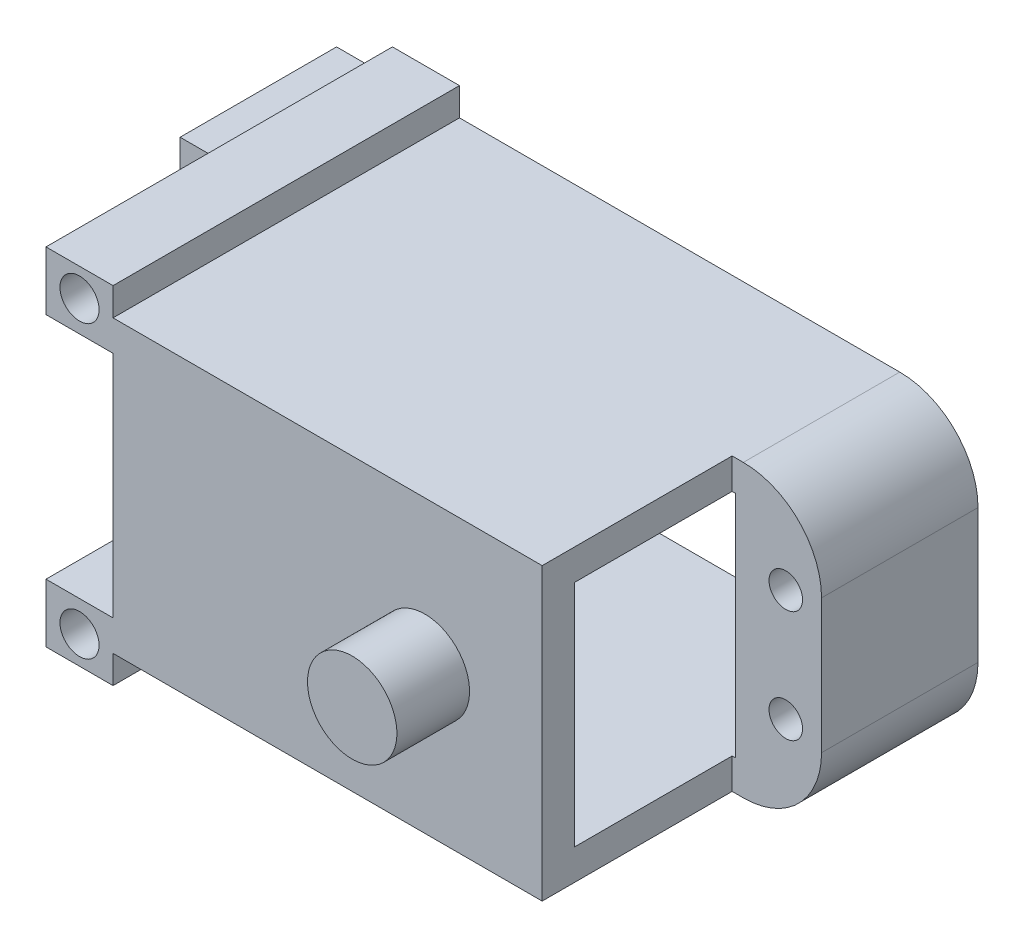
ISO-10303-21;
HEADER;
FILE_DESCRIPTION(('STEP AP214'),'2;1');
FILE_NAME('part.step','',(''),(''),'','','');
FILE_SCHEMA(('AUTOMOTIVE_DESIGN { 1 0 10303 214 1 1 1 1 }'));
ENDSEC;
DATA;
#1=APPLICATION_CONTEXT('core data for automotive mechanical design processes');
#2=APPLICATION_PROTOCOL_DEFINITION('international standard','automotive_design',2000,#1);
#3=PRODUCT_CONTEXT('',#1,'mechanical');
#4=PRODUCT('Part','Part','',(#3));
#5=PRODUCT_RELATED_PRODUCT_CATEGORY('part','',(#4));
#6=PRODUCT_DEFINITION_FORMATION('','',#4);
#7=PRODUCT_DEFINITION_CONTEXT('part definition',#1,'design');
#8=PRODUCT_DEFINITION('design','',#6,#7);
#9=PRODUCT_DEFINITION_SHAPE('','',#8);
#10=(LENGTH_UNIT() NAMED_UNIT(*) SI_UNIT(.MILLI.,.METRE.));
#11=(NAMED_UNIT(*) PLANE_ANGLE_UNIT() SI_UNIT($,.RADIAN.));
#12=(NAMED_UNIT(*) SI_UNIT($,.STERADIAN.) SOLID_ANGLE_UNIT());
#13=UNCERTAINTY_MEASURE_WITH_UNIT(LENGTH_MEASURE(1.E-05),#10,'distance_accuracy_value','');
#14=(GEOMETRIC_REPRESENTATION_CONTEXT(3) GLOBAL_UNCERTAINTY_ASSIGNED_CONTEXT((#13)) GLOBAL_UNIT_ASSIGNED_CONTEXT((#10,
#11,#12)) REPRESENTATION_CONTEXT('',''));
#15=CARTESIAN_POINT('',(0.,0.,0.));
#16=DIRECTION('',(0.,0.,1.));
#17=DIRECTION('',(1.,0.,0.));
#18=AXIS2_PLACEMENT_3D('',#15,#16,#17);
#19=CARTESIAN_POINT('',(0.,0.,31.));
#20=DIRECTION('',(0.,0.,-1.));
#21=DIRECTION('',(-1.,0.,0.));
#22=AXIS2_PLACEMENT_3D('',#19,#20,#21);
#23=PLANE('',#22);
#24=CARTESIAN_POINT('',(10.2,0.,31.));
#25=DIRECTION('',(0.,0.,-1.));
#26=DIRECTION('',(-1.,0.,0.));
#27=AXIS2_PLACEMENT_3D('',#24,#25,#26);
#28=CIRCLE('',#27,4.);
#29=CARTESIAN_POINT('',(6.2,0.,31.));
#30=VERTEX_POINT('',#29);
#31=EDGE_CURVE('E241',#30,#30,#28,.T.);
#32=ORIENTED_EDGE('',*,*,#31,.T.);
#33=EDGE_LOOP('',(#32));
#34=FACE_BOUND('',#33,.T.);
#35=DIRECTION('',(0.,1.,0.));
#36=VECTOR('',#35,1.);
#37=CARTESIAN_POINT('',(-17.7,-13.,31.));
#38=LINE('',#37,#36);
#39=CARTESIAN_POINT('',(-17.7,-10.25,31.));
#40=VERTEX_POINT('',#39);
#41=CARTESIAN_POINT('',(-17.7,10.25,31.));
#42=VERTEX_POINT('',#41);
#43=EDGE_CURVE('E310',#40,#42,#38,.T.);
#44=ORIENTED_EDGE('',*,*,#43,.F.);
#45=DIRECTION('',(1.,0.,0.));
#46=VECTOR('',#45,1.);
#47=CARTESIAN_POINT('',(-23.7,-10.25,31.));
#48=LINE('',#47,#46);
#49=CARTESIAN_POINT('',(-23.7,-10.25,31.));
#50=VERTEX_POINT('',#49);
#51=EDGE_CURVE('E298',#50,#40,#48,.T.);
#52=ORIENTED_EDGE('',*,*,#51,.F.);
#53=DIRECTION('',(0.,1.,0.));
#54=VECTOR('',#53,1.);
#55=CARTESIAN_POINT('',(-23.7,-10.25,31.));
#56=LINE('',#55,#54);
#57=CARTESIAN_POINT('',(-23.7,-15.5,31.));
#58=VERTEX_POINT('',#57);
#59=EDGE_CURVE('E295',#58,#50,#56,.T.);
#60=ORIENTED_EDGE('',*,*,#59,.F.);
#61=DIRECTION('',(-1.,0.,0.));
#62=VECTOR('',#61,1.);
#63=CARTESIAN_POINT('',(-23.7,-15.5,31.));
#64=LINE('',#63,#62);
#65=CARTESIAN_POINT('',(-17.7,-15.5,31.));
#66=VERTEX_POINT('',#65);
#67=EDGE_CURVE('E288',#66,#58,#64,.T.);
#68=ORIENTED_EDGE('',*,*,#67,.F.);
#69=DIRECTION('',(0.,1.,0.));
#70=VECTOR('',#69,1.);
#71=CARTESIAN_POINT('',(-17.7,-15.5,31.));
#72=LINE('',#71,#70);
#73=CARTESIAN_POINT('',(-17.7,-13.,31.));
#74=VERTEX_POINT('',#73);
#75=EDGE_CURVE('E291',#66,#74,#72,.T.);
#76=ORIENTED_EDGE('',*,*,#75,.T.);
#77=DIRECTION('',(1.,0.,0.));
#78=VECTOR('',#77,1.);
#79=CARTESIAN_POINT('',(28.7,-13.,31.));
#80=LINE('',#79,#78);
#81=CARTESIAN_POINT('',(20.7,-13.,31.));
#82=VERTEX_POINT('',#81);
#83=EDGE_CURVE('E389',#74,#82,#80,.T.);
#84=ORIENTED_EDGE('',*,*,#83,.T.);
#85=DIRECTION('',(0.,1.,0.));
#86=VECTOR('',#85,1.);
#87=CARTESIAN_POINT('',(20.7,-10.25,31.));
#88=LINE('',#87,#86);
#89=CARTESIAN_POINT('',(20.7,13.,31.));
#90=VERTEX_POINT('',#89);
#91=EDGE_CURVE('E353',#82,#90,#88,.T.);
#92=ORIENTED_EDGE('',*,*,#91,.T.);
#93=DIRECTION('',(-1.,0.,0.));
#94=VECTOR('',#93,1.);
#95=CARTESIAN_POINT('',(-28.7,13.,31.));
#96=LINE('',#95,#94);
#97=CARTESIAN_POINT('',(-17.7,13.,31.));
#98=VERTEX_POINT('',#97);
#99=EDGE_CURVE('E385',#90,#98,#96,.T.);
#100=ORIENTED_EDGE('',*,*,#99,.T.);
#101=DIRECTION('',(0.,1.,0.));
#102=VECTOR('',#101,1.);
#103=CARTESIAN_POINT('',(-17.7,15.5,31.));
#104=LINE('',#103,#102);
#105=CARTESIAN_POINT('',(-17.7,15.5,31.));
#106=VERTEX_POINT('',#105);
#107=EDGE_CURVE('E272',#98,#106,#104,.T.);
#108=ORIENTED_EDGE('',*,*,#107,.T.);
#109=DIRECTION('',(1.,0.,0.));
#110=VECTOR('',#109,1.);
#111=CARTESIAN_POINT('',(-23.7,15.5,31.));
#112=LINE('',#111,#110);
#113=CARTESIAN_POINT('',(-23.7,15.5,31.));
#114=VERTEX_POINT('',#113);
#115=EDGE_CURVE('E276',#114,#106,#112,.T.);
#116=ORIENTED_EDGE('',*,*,#115,.F.);
#117=DIRECTION('',(0.,1.,0.));
#118=VECTOR('',#117,1.);
#119=CARTESIAN_POINT('',(-23.7,15.5,31.));
#120=LINE('',#119,#118);
#121=CARTESIAN_POINT('',(-23.7,10.25,31.));
#122=VERTEX_POINT('',#121);
#123=EDGE_CURVE('E274',#122,#114,#120,.T.);
#124=ORIENTED_EDGE('',*,*,#123,.F.);
#125=DIRECTION('',(1.,0.,0.));
#126=VECTOR('',#125,1.);
#127=CARTESIAN_POINT('',(-23.7,10.25,31.));
#128=LINE('',#127,#126);
#129=EDGE_CURVE('E283',#122,#42,#128,.T.);
#130=ORIENTED_EDGE('',*,*,#129,.T.);
#131=EDGE_LOOP('',(#44,#52,#60,#68,#76,#84,#92,#100,#108,#116,#124,#130));
#132=FACE_BOUND('',#131,.T.);
#133=CARTESIAN_POINT('',(-20.7,-13.,31.));
#134=DIRECTION('',(0.,0.,1.));
#135=DIRECTION('',(1.,0.,0.));
#136=AXIS2_PLACEMENT_3D('',#133,#134,#135);
#137=CIRCLE('',#136,1.75);
#138=CARTESIAN_POINT('',(-18.95,-13.,31.));
#139=VERTEX_POINT('',#138);
#140=EDGE_CURVE('E1003',#139,#139,#137,.T.);
#141=ORIENTED_EDGE('',*,*,#140,.F.);
#142=EDGE_LOOP('',(#141));
#143=FACE_BOUND('',#142,.T.);
#144=CARTESIAN_POINT('',(-20.7,13.,31.));
#145=DIRECTION('',(0.,0.,1.));
#146=DIRECTION('',(1.,0.,0.));
#147=AXIS2_PLACEMENT_3D('',#144,#145,#146);
#148=CIRCLE('',#147,1.75);
#149=CARTESIAN_POINT('',(-18.95,13.,31.));
#150=VERTEX_POINT('',#149);
#151=EDGE_CURVE('E1000',#150,#150,#148,.T.);
#152=ORIENTED_EDGE('',*,*,#151,.F.);
#153=EDGE_LOOP('',(#152));
#154=FACE_BOUND('',#153,.T.);
#155=ADVANCED_FACE('F32',(#34,#132,#143,#154),#23,.F.);
#156=CARTESIAN_POINT('',(-21.,10.25,12.));
#157=DIRECTION('',(0.,0.,-1.));
#158=DIRECTION('',(-1.,0.,0.));
#159=AXIS2_PLACEMENT_3D('',#156,#157,#158);
#160=PLANE('',#159);
#161=DIRECTION('',(0.,1.,0.));
#162=VECTOR('',#161,1.);
#163=CARTESIAN_POINT('',(-23.7,13.,12.));
#164=LINE('',#163,#162);
#165=CARTESIAN_POINT('',(-23.7,-10.25,12.));
#166=VERTEX_POINT('',#165);
#167=CARTESIAN_POINT('',(-23.7,10.25,12.));
#168=VERTEX_POINT('',#167);
#169=EDGE_CURVE('E226',#166,#168,#164,.T.);
#170=ORIENTED_EDGE('',*,*,#169,.F.);
#171=DIRECTION('',(-1.,0.,0.));
#172=VECTOR('',#171,1.);
#173=CARTESIAN_POINT('',(-23.7,-10.25,12.));
#174=LINE('',#173,#172);
#175=CARTESIAN_POINT('',(-21.,-10.25,12.));
#176=VERTEX_POINT('',#175);
#177=EDGE_CURVE('E211',#176,#166,#174,.T.);
#178=ORIENTED_EDGE('',*,*,#177,.F.);
#179=DIRECTION('',(0.,-1.,0.));
#180=VECTOR('',#179,1.);
#181=CARTESIAN_POINT('',(-21.,10.25,12.));
#182=LINE('',#181,#180);
#183=CARTESIAN_POINT('',(-21.,10.25,12.));
#184=VERTEX_POINT('',#183);
#185=EDGE_CURVE('E378',#184,#176,#182,.T.);
#186=ORIENTED_EDGE('',*,*,#185,.F.);
#187=DIRECTION('',(1.,0.,0.));
#188=VECTOR('',#187,1.);
#189=CARTESIAN_POINT('',(-23.7,10.25,12.));
#190=LINE('',#189,#188);
#191=EDGE_CURVE('E230',#168,#184,#190,.T.);
#192=ORIENTED_EDGE('',*,*,#191,.F.);
#193=EDGE_LOOP('',(#170,#178,#186,#192));
#194=FACE_BOUND('',#193,.T.);
#195=ADVANCED_FACE('F233',(#194),#160,.F.);
#196=CARTESIAN_POINT('',(-17.7,0.,0.));
#197=DIRECTION('',(-1.,0.,0.));
#198=DIRECTION('',(0.,0.,1.));
#199=AXIS2_PLACEMENT_3D('',#196,#197,#198);
#200=PLANE('',#199);
#201=ORIENTED_EDGE('',*,*,#43,.T.);
#202=DIRECTION('',(0.,0.,1.));
#203=VECTOR('',#202,1.);
#204=CARTESIAN_POINT('',(-17.7,10.25,31.));
#205=LINE('',#204,#203);
#206=CARTESIAN_POINT('',(-17.7,10.25,28.1));
#207=VERTEX_POINT('',#206);
#208=EDGE_CURVE('E266',#207,#42,#205,.T.);
#209=ORIENTED_EDGE('',*,*,#208,.F.);
#210=DIRECTION('',(0.,-1.,0.));
#211=VECTOR('',#210,1.);
#212=CARTESIAN_POINT('',(-17.7,10.25,28.1));
#213=LINE('',#212,#211);
#214=CARTESIAN_POINT('',(-17.7,-10.25,28.1));
#215=VERTEX_POINT('',#214);
#216=EDGE_CURVE('E312',#207,#215,#213,.T.);
#217=ORIENTED_EDGE('',*,*,#216,.T.);
#218=DIRECTION('',(0.,0.,-1.));
#219=VECTOR('',#218,1.);
#220=CARTESIAN_POINT('',(-17.7,-10.25,19.));
#221=LINE('',#220,#219);
#222=EDGE_CURVE('E294',#40,#215,#221,.T.);
#223=ORIENTED_EDGE('',*,*,#222,.F.);
#224=EDGE_LOOP('',(#201,#209,#217,#223));
#225=FACE_BOUND('',#224,.T.);
#226=ADVANCED_FACE('F509',(#225),#200,.T.);
#227=CARTESIAN_POINT('',(-28.7,-13.,0.));
#228=DIRECTION('',(0.,-1.,0.));
#229=DIRECTION('',(1.,0.,0.));
#230=AXIS2_PLACEMENT_3D('',#227,#228,#229);
#231=PLANE('',#230);
#232=DIRECTION('',(1.,0.,0.));
#233=VECTOR('',#232,1.);
#234=CARTESIAN_POINT('',(-28.7,-13.,0.));
#235=LINE('',#234,#233);
#236=CARTESIAN_POINT('',(-17.7,-13.,0.));
#237=VERTEX_POINT('',#236);
#238=CARTESIAN_POINT('',(21.7,-13.,0.));
#239=VERTEX_POINT('',#238);
#240=EDGE_CURVE('E396',#237,#239,#235,.T.);
#241=ORIENTED_EDGE('',*,*,#240,.T.);
#242=DIRECTION('',(0.,0.,1.));
#243=VECTOR('',#242,1.);
#244=CARTESIAN_POINT('',(21.7,-13.,0.));
#245=LINE('',#244,#243);
#246=CARTESIAN_POINT('',(21.7,-13.,14.));
#247=VERTEX_POINT('',#246);
#248=EDGE_CURVE('E402',#239,#247,#245,.T.);
#249=ORIENTED_EDGE('',*,*,#248,.T.);
#250=DIRECTION('',(1.,0.,0.));
#251=VECTOR('',#250,1.);
#252=CARTESIAN_POINT('',(20.7,-13.,14.));
#253=LINE('',#252,#251);
#254=CARTESIAN_POINT('',(20.7,-13.,14.));
#255=VERTEX_POINT('',#254);
#256=EDGE_CURVE('E315',#255,#247,#253,.T.);
#257=ORIENTED_EDGE('',*,*,#256,.F.);
#258=DIRECTION('',(0.,0.,1.));
#259=VECTOR('',#258,1.);
#260=CARTESIAN_POINT('',(20.7,-13.,28.1));
#261=LINE('',#260,#259);
#262=EDGE_CURVE('E350',#255,#82,#261,.T.);
#263=ORIENTED_EDGE('',*,*,#262,.T.);
#264=ORIENTED_EDGE('',*,*,#83,.F.);
#265=DIRECTION('',(0.,0.,1.));
#266=VECTOR('',#265,1.);
#267=CARTESIAN_POINT('',(-17.7,-13.,12.));
#268=LINE('',#267,#266);
#269=EDGE_CURVE('E308',#237,#74,#268,.T.);
#270=ORIENTED_EDGE('',*,*,#269,.F.);
#271=EDGE_LOOP('',(#241,#249,#257,#263,#264,#270));
#272=FACE_BOUND('',#271,.T.);
#273=ADVANCED_FACE('F424',(#272),#231,.T.);
#274=CARTESIAN_POINT('',(-28.7,13.,31.));
#275=DIRECTION('',(0.,-1.,0.));
#276=DIRECTION('',(0.,0.,-1.));
#277=AXIS2_PLACEMENT_3D('',#274,#275,#276);
#278=PLANE('',#277);
#279=DIRECTION('',(-1.,0.,0.));
#280=VECTOR('',#279,1.);
#281=CARTESIAN_POINT('',(28.7,13.,14.));
#282=LINE('',#281,#280);
#283=CARTESIAN_POINT('',(21.7,13.,14.));
#284=VERTEX_POINT('',#283);
#285=CARTESIAN_POINT('',(20.7,13.,14.));
#286=VERTEX_POINT('',#285);
#287=EDGE_CURVE('E321',#284,#286,#282,.T.);
#288=ORIENTED_EDGE('',*,*,#287,.F.);
#289=DIRECTION('',(0.,0.,-1.));
#290=VECTOR('',#289,1.);
#291=CARTESIAN_POINT('',(21.7,13.,0.));
#292=LINE('',#291,#290);
#293=CARTESIAN_POINT('',(21.7,13.,0.));
#294=VERTEX_POINT('',#293);
#295=EDGE_CURVE('E11',#284,#294,#292,.T.);
#296=ORIENTED_EDGE('',*,*,#295,.T.);
#297=DIRECTION('',(1.,0.,0.));
#298=VECTOR('',#297,1.);
#299=CARTESIAN_POINT('',(-17.7,13.,0.));
#300=LINE('',#299,#298);
#301=CARTESIAN_POINT('',(-17.7,13.,0.));
#302=VERTEX_POINT('',#301);
#303=EDGE_CURVE('E346',#302,#294,#300,.T.);
#304=ORIENTED_EDGE('',*,*,#303,.F.);
#305=DIRECTION('',(0.,0.,-1.));
#306=VECTOR('',#305,1.);
#307=CARTESIAN_POINT('',(-17.7,13.,12.));
#308=LINE('',#307,#306);
#309=EDGE_CURVE('E338',#98,#302,#308,.T.);
#310=ORIENTED_EDGE('',*,*,#309,.F.);
#311=ORIENTED_EDGE('',*,*,#99,.F.);
#312=DIRECTION('',(0.,0.,1.));
#313=VECTOR('',#312,1.);
#314=CARTESIAN_POINT('',(20.7,13.,28.1));
#315=LINE('',#314,#313);
#316=EDGE_CURVE('E349',#286,#90,#315,.T.);
#317=ORIENTED_EDGE('',*,*,#316,.F.);
#318=EDGE_LOOP('',(#288,#296,#304,#310,#311,#317));
#319=FACE_BOUND('',#318,.T.);
#320=ADVANCED_FACE('F437',(#319),#278,.F.);
#321=CARTESIAN_POINT('',(-21.,-10.25,28.1));
#322=DIRECTION('',(0.,0.,1.));
#323=DIRECTION('',(1.,0.,0.));
#324=AXIS2_PLACEMENT_3D('',#321,#322,#323);
#325=PLANE('',#324);
#326=ORIENTED_EDGE('',*,*,#216,.F.);
#327=DIRECTION('',(-1.,0.,0.));
#328=VECTOR('',#327,1.);
#329=CARTESIAN_POINT('',(-21.,10.25,28.1));
#330=LINE('',#329,#328);
#331=CARTESIAN_POINT('',(20.7,10.25,28.1));
#332=VERTEX_POINT('',#331);
#333=EDGE_CURVE('E381',#332,#207,#330,.T.);
#334=ORIENTED_EDGE('',*,*,#333,.F.);
#335=DIRECTION('',(0.,1.,0.));
#336=VECTOR('',#335,1.);
#337=CARTESIAN_POINT('',(20.7,-10.25,28.1));
#338=LINE('',#337,#336);
#339=CARTESIAN_POINT('',(20.7,-10.25,28.1));
#340=VERTEX_POINT('',#339);
#341=EDGE_CURVE('E366',#340,#332,#338,.T.);
#342=ORIENTED_EDGE('',*,*,#341,.F.);
#343=DIRECTION('',(-1.,0.,0.));
#344=VECTOR('',#343,1.);
#345=CARTESIAN_POINT('',(-21.,-10.25,28.1));
#346=LINE('',#345,#344);
#347=EDGE_CURVE('E382',#340,#215,#346,.T.);
#348=ORIENTED_EDGE('',*,*,#347,.T.);
#349=EDGE_LOOP('',(#326,#334,#342,#348));
#350=FACE_BOUND('',#349,.T.);
#351=ADVANCED_FACE('F513',(#350),#325,.F.);
#352=CARTESIAN_POINT('',(28.7,-13.,0.));
#353=DIRECTION('',(1.,0.,0.));
#354=DIRECTION('',(0.,1.,0.));
#355=AXIS2_PLACEMENT_3D('',#352,#353,#354);
#356=PLANE('',#355);
#357=DIRECTION('',(0.,1.,0.));
#358=VECTOR('',#357,1.);
#359=CARTESIAN_POINT('',(28.7,-13.,14.));
#360=LINE('',#359,#358);
#361=CARTESIAN_POINT('',(28.7,-6.,14.));
#362=VERTEX_POINT('',#361);
#363=CARTESIAN_POINT('',(28.7,5.99999999999999,14.));
#364=VERTEX_POINT('',#363);
#365=EDGE_CURVE('E318',#362,#364,#360,.T.);
#366=ORIENTED_EDGE('',*,*,#365,.F.);
#367=DIRECTION('',(0.,0.,1.));
#368=VECTOR('',#367,1.);
#369=CARTESIAN_POINT('',(28.7,-6.,0.));
#370=LINE('',#369,#368);
#371=CARTESIAN_POINT('',(28.7,-6.,0.));
#372=VERTEX_POINT('',#371);
#373=EDGE_CURVE('E411',#362,#372,#370,.F.);
#374=ORIENTED_EDGE('',*,*,#373,.T.);
#375=DIRECTION('',(0.,1.,0.));
#376=VECTOR('',#375,1.);
#377=CARTESIAN_POINT('',(28.7,-13.,0.));
#378=LINE('',#377,#376);
#379=CARTESIAN_POINT('',(28.7,6.,0.));
#380=VERTEX_POINT('',#379);
#381=EDGE_CURVE('E399',#372,#380,#378,.T.);
#382=ORIENTED_EDGE('',*,*,#381,.T.);
#383=DIRECTION('',(0.,0.,-1.));
#384=VECTOR('',#383,1.);
#385=CARTESIAN_POINT('',(28.7,6.,14.));
#386=LINE('',#385,#384);
#387=EDGE_CURVE('E409',#380,#364,#386,.F.);
#388=ORIENTED_EDGE('',*,*,#387,.T.);
#389=EDGE_LOOP('',(#366,#374,#382,#388));
#390=FACE_BOUND('',#389,.T.);
#391=ADVANCED_FACE('F433',(#390),#356,.T.);
#392=CARTESIAN_POINT('',(21.,0.,0.));
#393=DIRECTION('',(-1.,0.,0.));
#394=DIRECTION('',(0.,0.,1.));
#395=AXIS2_PLACEMENT_3D('',#392,#393,#394);
#396=PLANE('',#395);
#397=DIRECTION('',(0.,0.,1.));
#398=VECTOR('',#397,1.);
#399=CARTESIAN_POINT('',(21.,-10.25,0.));
#400=LINE('',#399,#398);
#401=CARTESIAN_POINT('',(21.,-10.25,0.));
#402=VERTEX_POINT('',#401);
#403=CARTESIAN_POINT('',(21.,-10.25,14.));
#404=VERTEX_POINT('',#403);
#405=EDGE_CURVE('E359',#402,#404,#400,.T.);
#406=ORIENTED_EDGE('',*,*,#405,.T.);
#407=DIRECTION('',(0.,-1.,0.));
#408=VECTOR('',#407,1.);
#409=CARTESIAN_POINT('',(21.,10.25,14.));
#410=LINE('',#409,#408);
#411=CARTESIAN_POINT('',(21.,10.25,14.));
#412=VERTEX_POINT('',#411);
#413=EDGE_CURVE('E328',#412,#404,#410,.T.);
#414=ORIENTED_EDGE('',*,*,#413,.F.);
#415=DIRECTION('',(0.,0.,-1.));
#416=VECTOR('',#415,1.);
#417=CARTESIAN_POINT('',(21.,10.25,31.));
#418=LINE('',#417,#416);
#419=CARTESIAN_POINT('',(21.,10.25,0.));
#420=VERTEX_POINT('',#419);
#421=EDGE_CURVE('E362',#412,#420,#418,.T.);
#422=ORIENTED_EDGE('',*,*,#421,.T.);
#423=DIRECTION('',(0.,-1.,0.));
#424=VECTOR('',#423,1.);
#425=CARTESIAN_POINT('',(21.,10.25,0.));
#426=LINE('',#425,#424);
#427=EDGE_CURVE('E356',#420,#402,#426,.T.);
#428=ORIENTED_EDGE('',*,*,#427,.T.);
#429=EDGE_LOOP('',(#406,#414,#422,#428));
#430=FACE_BOUND('',#429,.T.);
#431=ADVANCED_FACE('F451',(#430),#396,.T.);
#432=CARTESIAN_POINT('',(-21.,-10.25,12.));
#433=DIRECTION('',(0.,-1.,0.));
#434=DIRECTION('',(0.,0.,-1.));
#435=AXIS2_PLACEMENT_3D('',#432,#433,#434);
#436=PLANE('',#435);
#437=DIRECTION('',(0.,0.,1.));
#438=VECTOR('',#437,1.);
#439=CARTESIAN_POINT('',(-21.,-10.25,0.));
#440=LINE('',#439,#438);
#441=CARTESIAN_POINT('',(-21.,-10.25,0.));
#442=VERTEX_POINT('',#441);
#443=EDGE_CURVE('E217',#442,#176,#440,.T.);
#444=ORIENTED_EDGE('',*,*,#443,.T.);
#445=ORIENTED_EDGE('',*,*,#177,.T.);
#446=DIRECTION('',(0.,0.,1.));
#447=VECTOR('',#446,1.);
#448=CARTESIAN_POINT('',(-23.7,-10.25,4.02739064044899));
#449=LINE('',#448,#447);
#450=CARTESIAN_POINT('',(-23.7,-10.25,14.));
#451=VERTEX_POINT('',#450);
#452=EDGE_CURVE('E214',#166,#451,#449,.T.);
#453=ORIENTED_EDGE('',*,*,#452,.T.);
#454=DIRECTION('',(0.,0.,-1.));
#455=VECTOR('',#454,1.);
#456=CARTESIAN_POINT('',(-23.7,-10.25,19.));
#457=LINE('',#456,#455);
#458=EDGE_CURVE('E47',#50,#451,#457,.T.);
#459=ORIENTED_EDGE('',*,*,#458,.F.);
#460=ORIENTED_EDGE('',*,*,#51,.T.);
#461=ORIENTED_EDGE('',*,*,#222,.T.);
#462=ORIENTED_EDGE('',*,*,#347,.F.);
#463=DIRECTION('',(0.,0.,1.));
#464=VECTOR('',#463,1.);
#465=CARTESIAN_POINT('',(20.7,-10.25,14.));
#466=LINE('',#465,#464);
#467=CARTESIAN_POINT('',(20.7,-10.25,14.));
#468=VERTEX_POINT('',#467);
#469=EDGE_CURVE('E336',#468,#340,#466,.T.);
#470=ORIENTED_EDGE('',*,*,#469,.F.);
#471=DIRECTION('',(-1.,0.,0.));
#472=VECTOR('',#471,1.);
#473=CARTESIAN_POINT('',(21.,-10.25,14.));
#474=LINE('',#473,#472);
#475=EDGE_CURVE('E330',#404,#468,#474,.T.);
#476=ORIENTED_EDGE('',*,*,#475,.F.);
#477=ORIENTED_EDGE('',*,*,#405,.F.);
#478=DIRECTION('',(-1.,0.,0.));
#479=VECTOR('',#478,1.);
#480=CARTESIAN_POINT('',(20.7,-10.25,0.));
#481=LINE('',#480,#479);
#482=EDGE_CURVE('E369',#402,#442,#481,.T.);
#483=ORIENTED_EDGE('',*,*,#482,.T.);
#484=EDGE_LOOP('',(#444,#445,#453,#459,#460,#461,#462,#470,#476,#477,#483));
#485=FACE_BOUND('',#484,.T.);
#486=ADVANCED_FACE('F213',(#485),#436,.F.);
#487=CARTESIAN_POINT('',(-21.,10.25,28.1));
#488=DIRECTION('',(0.,1.,0.));
#489=DIRECTION('',(0.,0.,1.));
#490=AXIS2_PLACEMENT_3D('',#487,#488,#489);
#491=PLANE('',#490);
#492=ORIENTED_EDGE('',*,*,#191,.T.);
#493=DIRECTION('',(0.,0.,-1.));
#494=VECTOR('',#493,1.);
#495=CARTESIAN_POINT('',(-21.,10.25,28.1));
#496=LINE('',#495,#494);
#497=CARTESIAN_POINT('',(-21.,10.25,0.));
#498=VERTEX_POINT('',#497);
#499=EDGE_CURVE('E370',#184,#498,#496,.T.);
#500=ORIENTED_EDGE('',*,*,#499,.T.);
#501=DIRECTION('',(-1.,0.,0.));
#502=VECTOR('',#501,1.);
#503=CARTESIAN_POINT('',(20.7,10.25,0.));
#504=LINE('',#503,#502);
#505=EDGE_CURVE('E375',#420,#498,#504,.T.);
#506=ORIENTED_EDGE('',*,*,#505,.F.);
#507=ORIENTED_EDGE('',*,*,#421,.F.);
#508=DIRECTION('',(1.,0.,0.));
#509=VECTOR('',#508,1.);
#510=CARTESIAN_POINT('',(20.7,10.25,14.));
#511=LINE('',#510,#509);
#512=CARTESIAN_POINT('',(20.7,10.25,14.));
#513=VERTEX_POINT('',#512);
#514=EDGE_CURVE('E326',#513,#412,#511,.T.);
#515=ORIENTED_EDGE('',*,*,#514,.F.);
#516=DIRECTION('',(0.,0.,1.));
#517=VECTOR('',#516,1.);
#518=CARTESIAN_POINT('',(20.7,10.25,14.));
#519=LINE('',#518,#517);
#520=EDGE_CURVE('E335',#513,#332,#519,.T.);
#521=ORIENTED_EDGE('',*,*,#520,.T.);
#522=ORIENTED_EDGE('',*,*,#333,.T.);
#523=ORIENTED_EDGE('',*,*,#208,.T.);
#524=ORIENTED_EDGE('',*,*,#129,.F.);
#525=DIRECTION('',(0.,0.,1.));
#526=VECTOR('',#525,1.);
#527=CARTESIAN_POINT('',(-23.7,10.25,31.));
#528=LINE('',#527,#526);
#529=CARTESIAN_POINT('',(-23.7,10.25,14.));
#530=VERTEX_POINT('',#529);
#531=EDGE_CURVE('E271',#530,#122,#528,.T.);
#532=ORIENTED_EDGE('',*,*,#531,.F.);
#533=DIRECTION('',(0.,0.,1.));
#534=VECTOR('',#533,1.);
#535=CARTESIAN_POINT('',(-23.7,10.25,4.02739064044899));
#536=LINE('',#535,#534);
#537=EDGE_CURVE('E967',#168,#530,#536,.T.);
#538=ORIENTED_EDGE('',*,*,#537,.F.);
#539=EDGE_LOOP('',(#492,#500,#506,#507,#515,#521,#522,#523,#524,#532,#538));
#540=FACE_BOUND('',#539,.T.);
#541=ADVANCED_FACE('F447',(#540),#491,.F.);
#542=CARTESIAN_POINT('',(28.7,15.5,0.));
#543=DIRECTION('',(0.,1.,0.));
#544=DIRECTION('',(0.,0.,1.));
#545=AXIS2_PLACEMENT_3D('',#542,#543,#544);
#546=PLANE('',#545);
#547=DIRECTION('',(-1.,0.,0.));
#548=VECTOR('',#547,1.);
#549=CARTESIAN_POINT('',(28.7,15.5,0.));
#550=LINE('',#549,#548);
#551=CARTESIAN_POINT('',(-17.7,15.5,0.));
#552=VERTEX_POINT('',#551);
#553=CARTESIAN_POINT('',(-23.7,15.5,0.));
#554=VERTEX_POINT('',#553);
#555=EDGE_CURVE('E391',#552,#554,#550,.T.);
#556=ORIENTED_EDGE('',*,*,#555,.T.);
#557=DIRECTION('',(0.,0.,-1.));
#558=VECTOR('',#557,1.);
#559=CARTESIAN_POINT('',(-23.7,15.5,19.));
#560=LINE('',#559,#558);
#561=EDGE_CURVE('E269',#114,#554,#560,.T.);
#562=ORIENTED_EDGE('',*,*,#561,.F.);
#563=ORIENTED_EDGE('',*,*,#115,.T.);
#564=DIRECTION('',(0.,0.,1.));
#565=VECTOR('',#564,1.);
#566=CARTESIAN_POINT('',(-17.7,15.5,0.));
#567=LINE('',#566,#565);
#568=EDGE_CURVE('E344',#552,#106,#567,.T.);
#569=ORIENTED_EDGE('',*,*,#568,.F.);
#570=EDGE_LOOP('',(#556,#562,#563,#569));
#571=FACE_BOUND('',#570,.T.);
#572=ADVANCED_FACE('F497',(#571),#546,.T.);
#573=CARTESIAN_POINT('',(0.,0.,0.));
#574=DIRECTION('',(0.,0.,1.));
#575=DIRECTION('',(1.,0.,0.));
#576=AXIS2_PLACEMENT_3D('',#573,#574,#575);
#577=PLANE('',#576);
#578=CARTESIAN_POINT('',(-20.7,13.,0.));
#579=DIRECTION('',(0.,0.,1.));
#580=DIRECTION('',(1.,0.,0.));
#581=AXIS2_PLACEMENT_3D('',#578,#579,#580);
#582=CIRCLE('',#581,1.75);
#583=CARTESIAN_POINT('',(-18.95,13.,0.));
#584=VERTEX_POINT('',#583);
#585=EDGE_CURVE('E969',#584,#584,#582,.T.);
#586=ORIENTED_EDGE('',*,*,#585,.T.);
#587=EDGE_LOOP('',(#586));
#588=FACE_BOUND('',#587,.T.);
#589=CARTESIAN_POINT('',(-20.7,-13.,0.));
#590=DIRECTION('',(0.,0.,1.));
#591=DIRECTION('',(1.,0.,0.));
#592=AXIS2_PLACEMENT_3D('',#589,#590,#591);
#593=CIRCLE('',#592,1.75);
#594=CARTESIAN_POINT('',(-18.95,-13.,0.));
#595=VERTEX_POINT('',#594);
#596=EDGE_CURVE('E974',#595,#595,#593,.T.);
#597=ORIENTED_EDGE('',*,*,#596,.T.);
#598=EDGE_LOOP('',(#597));
#599=FACE_BOUND('',#598,.T.);
#600=CARTESIAN_POINT('',(25.5,-5.,0.));
#601=DIRECTION('',(0.,0.,-1.));
#602=DIRECTION('',(-1.,0.,0.));
#603=AXIS2_PLACEMENT_3D('',#600,#601,#602);
#604=CIRCLE('',#603,1.49999999999999);
#605=CARTESIAN_POINT('',(24.,-5.,0.));
#606=VERTEX_POINT('',#605);
#607=EDGE_CURVE('E977',#606,#606,#604,.T.);
#608=ORIENTED_EDGE('',*,*,#607,.F.);
#609=EDGE_LOOP('',(#608));
#610=FACE_BOUND('',#609,.T.);
#611=CARTESIAN_POINT('',(25.5,5.,0.));
#612=DIRECTION('',(0.,0.,-1.));
#613=DIRECTION('',(-1.,0.,0.));
#614=AXIS2_PLACEMENT_3D('',#611,#612,#613);
#615=CIRCLE('',#614,1.49999999999999);
#616=CARTESIAN_POINT('',(24.,5.,0.));
#617=VERTEX_POINT('',#616);
#618=EDGE_CURVE('E982',#617,#617,#615,.T.);
#619=ORIENTED_EDGE('',*,*,#618,.F.);
#620=EDGE_LOOP('',(#619));
#621=FACE_BOUND('',#620,.T.);
#622=CARTESIAN_POINT('',(-25.5,-5.,0.));
#623=DIRECTION('',(0.,0.,-1.));
#624=DIRECTION('',(-1.,0.,0.));
#625=AXIS2_PLACEMENT_3D('',#622,#623,#624);
#626=CIRCLE('',#625,1.49999999999999);
#627=CARTESIAN_POINT('',(-27.,-5.,0.));
#628=VERTEX_POINT('',#627);
#629=EDGE_CURVE('E988',#628,#628,#626,.T.);
#630=ORIENTED_EDGE('',*,*,#629,.F.);
#631=EDGE_LOOP('',(#630));
#632=FACE_BOUND('',#631,.T.);
#633=CARTESIAN_POINT('',(-25.5,5.,0.));
#634=DIRECTION('',(0.,0.,-1.));
#635=DIRECTION('',(-1.,0.,0.));
#636=AXIS2_PLACEMENT_3D('',#633,#634,#635);
#637=CIRCLE('',#636,1.49999999999999);
#638=CARTESIAN_POINT('',(-27.,5.,0.));
#639=VERTEX_POINT('',#638);
#640=EDGE_CURVE('E994',#639,#639,#637,.T.);
#641=ORIENTED_EDGE('',*,*,#640,.F.);
#642=EDGE_LOOP('',(#641));
#643=FACE_BOUND('',#642,.T.);
#644=ORIENTED_EDGE('',*,*,#381,.F.);
#645=CARTESIAN_POINT('',(21.7,-6.,0.));
#646=DIRECTION('',(0.,0.,1.));
#647=DIRECTION('',(1.,0.,0.));
#648=AXIS2_PLACEMENT_3D('',#645,#646,#647);
#649=CIRCLE('',#648,7.);
#650=EDGE_CURVE('E40',#372,#239,#649,.F.);
#651=ORIENTED_EDGE('',*,*,#650,.T.);
#652=ORIENTED_EDGE('',*,*,#240,.F.);
#653=DIRECTION('',(0.,1.,0.));
#654=VECTOR('',#653,1.);
#655=CARTESIAN_POINT('',(-17.7,-15.5,0.));
#656=LINE('',#655,#654);
#657=CARTESIAN_POINT('',(-17.7,-15.5,0.));
#658=VERTEX_POINT('',#657);
#659=EDGE_CURVE('E305',#658,#237,#656,.T.);
#660=ORIENTED_EDGE('',*,*,#659,.F.);
#661=DIRECTION('',(1.,0.,0.));
#662=VECTOR('',#661,1.);
#663=CARTESIAN_POINT('',(-17.7,-15.5,0.));
#664=LINE('',#663,#662);
#665=CARTESIAN_POINT('',(-23.7,-15.5,0.));
#666=VERTEX_POINT('',#665);
#667=EDGE_CURVE('E303',#666,#658,#664,.T.);
#668=ORIENTED_EDGE('',*,*,#667,.F.);
#669=DIRECTION('',(0.,-1.,0.));
#670=VECTOR('',#669,1.);
#671=CARTESIAN_POINT('',(-23.7,-13.,0.));
#672=LINE('',#671,#670);
#673=CARTESIAN_POINT('',(-23.7,-13.,0.));
#674=VERTEX_POINT('',#673);
#675=EDGE_CURVE('E260',#674,#666,#672,.T.);
#676=ORIENTED_EDGE('',*,*,#675,.F.);
#677=DIRECTION('',(1.,0.,0.));
#678=VECTOR('',#677,1.);
#679=CARTESIAN_POINT('',(-28.7,-13.,0.));
#680=LINE('',#679,#678);
#681=CARTESIAN_POINT('',(-28.7,-13.,0.));
#682=VERTEX_POINT('',#681);
#683=EDGE_CURVE('E256',#682,#674,#680,.T.);
#684=ORIENTED_EDGE('',*,*,#683,.F.);
#685=DIRECTION('',(0.,-1.,0.));
#686=VECTOR('',#685,1.);
#687=CARTESIAN_POINT('',(-28.7,15.5,0.));
#688=LINE('',#687,#686);
#689=CARTESIAN_POINT('',(-28.7,13.,0.));
#690=VERTEX_POINT('',#689);
#691=EDGE_CURVE('E394',#690,#682,#688,.T.);
#692=ORIENTED_EDGE('',*,*,#691,.F.);
#693=DIRECTION('',(-1.,0.,0.));
#694=VECTOR('',#693,1.);
#695=CARTESIAN_POINT('',(-23.7,13.,0.));
#696=LINE('',#695,#694);
#697=CARTESIAN_POINT('',(-23.7,13.,0.));
#698=VERTEX_POINT('',#697);
#699=EDGE_CURVE('E250',#698,#690,#696,.T.);
#700=ORIENTED_EDGE('',*,*,#699,.F.);
#701=DIRECTION('',(0.,-1.,0.));
#702=VECTOR('',#701,1.);
#703=CARTESIAN_POINT('',(-23.7,15.5,0.));
#704=LINE('',#703,#702);
#705=EDGE_CURVE('E247',#554,#698,#704,.T.);
#706=ORIENTED_EDGE('',*,*,#705,.F.);
#707=ORIENTED_EDGE('',*,*,#555,.F.);
#708=DIRECTION('',(0.,1.,0.));
#709=VECTOR('',#708,1.);
#710=CARTESIAN_POINT('',(-17.7,13.,0.));
#711=LINE('',#710,#709);
#712=EDGE_CURVE('E342',#302,#552,#711,.T.);
#713=ORIENTED_EDGE('',*,*,#712,.F.);
#714=ORIENTED_EDGE('',*,*,#303,.T.);
#715=CARTESIAN_POINT('',(21.7,6.,0.));
#716=DIRECTION('',(0.,0.,1.));
#717=DIRECTION('',(1.,0.,0.));
#718=AXIS2_PLACEMENT_3D('',#715,#716,#717);
#719=CIRCLE('',#718,7.);
#720=EDGE_CURVE('E55',#294,#380,#719,.F.);
#721=ORIENTED_EDGE('',*,*,#720,.T.);
#722=EDGE_LOOP('',(#644,#651,#652,#660,#668,#676,#684,#692,#700,#706,#707,#713,#714,#721));
#723=FACE_BOUND('',#722,.T.);
#724=ORIENTED_EDGE('',*,*,#427,.F.);
#725=ORIENTED_EDGE('',*,*,#505,.T.);
#726=DIRECTION('',(0.,-1.,0.));
#727=VECTOR('',#726,1.);
#728=CARTESIAN_POINT('',(-21.,10.25,0.));
#729=LINE('',#728,#727);
#730=EDGE_CURVE('E364',#498,#442,#729,.T.);
#731=ORIENTED_EDGE('',*,*,#730,.T.);
#732=ORIENTED_EDGE('',*,*,#482,.F.);
#733=EDGE_LOOP('',(#724,#725,#731,#732));
#734=FACE_BOUND('',#733,.T.);
#735=ADVANCED_FACE('F417',(#588,#599,#610,#621,#632,#643,#723,#734),#577,.F.);
#736=CARTESIAN_POINT('',(-28.7,15.5,0.));
#737=DIRECTION('',(-1.,0.,0.));
#738=DIRECTION('',(0.,0.,1.));
#739=AXIS2_PLACEMENT_3D('',#736,#737,#738);
#740=PLANE('',#739);
#741=DIRECTION('',(0.,0.,-1.));
#742=VECTOR('',#741,1.);
#743=CARTESIAN_POINT('',(-28.7,13.,31.));
#744=LINE('',#743,#742);
#745=CARTESIAN_POINT('',(-28.7,13.,14.));
#746=VERTEX_POINT('',#745);
#747=EDGE_CURVE('E253',#746,#690,#744,.T.);
#748=ORIENTED_EDGE('',*,*,#747,.T.);
#749=ORIENTED_EDGE('',*,*,#691,.T.);
#750=DIRECTION('',(0.,0.,-1.));
#751=VECTOR('',#750,1.);
#752=CARTESIAN_POINT('',(-28.7,-13.,31.));
#753=LINE('',#752,#751);
#754=CARTESIAN_POINT('',(-28.7,-13.,14.));
#755=VERTEX_POINT('',#754);
#756=EDGE_CURVE('E263',#755,#682,#753,.T.);
#757=ORIENTED_EDGE('',*,*,#756,.F.);
#758=DIRECTION('',(0.,-1.,0.));
#759=VECTOR('',#758,1.);
#760=CARTESIAN_POINT('',(-28.7,-13.,14.));
#761=LINE('',#760,#759);
#762=EDGE_CURVE('E238',#746,#755,#761,.T.);
#763=ORIENTED_EDGE('',*,*,#762,.F.);
#764=EDGE_LOOP('',(#748,#749,#757,#763));
#765=FACE_BOUND('',#764,.T.);
#766=ADVANCED_FACE('F482',(#765),#740,.T.);
#767=CARTESIAN_POINT('',(-21.,0.,0.));
#768=DIRECTION('',(-1.,0.,0.));
#769=DIRECTION('',(0.,0.,1.));
#770=AXIS2_PLACEMENT_3D('',#767,#768,#769);
#771=PLANE('',#770);
#772=ORIENTED_EDGE('',*,*,#185,.T.);
#773=ORIENTED_EDGE('',*,*,#443,.F.);
#774=ORIENTED_EDGE('',*,*,#730,.F.);
#775=ORIENTED_EDGE('',*,*,#499,.F.);
#776=EDGE_LOOP('',(#772,#773,#774,#775));
#777=FACE_BOUND('',#776,.T.);
#778=ADVANCED_FACE('F539',(#777),#771,.F.);
#779=CARTESIAN_POINT('',(20.7,0.,0.));
#780=DIRECTION('',(-1.,0.,0.));
#781=DIRECTION('',(0.,0.,1.));
#782=AXIS2_PLACEMENT_3D('',#779,#780,#781);
#783=PLANE('',#782);
#784=ORIENTED_EDGE('',*,*,#341,.T.);
#785=ORIENTED_EDGE('',*,*,#520,.F.);
#786=DIRECTION('',(0.,-1.,0.));
#787=VECTOR('',#786,1.);
#788=CARTESIAN_POINT('',(20.7,13.,14.));
#789=LINE('',#788,#787);
#790=EDGE_CURVE('E323',#286,#513,#789,.T.);
#791=ORIENTED_EDGE('',*,*,#790,.F.);
#792=ORIENTED_EDGE('',*,*,#316,.T.);
#793=ORIENTED_EDGE('',*,*,#91,.F.);
#794=ORIENTED_EDGE('',*,*,#262,.F.);
#795=DIRECTION('',(0.,-1.,0.));
#796=VECTOR('',#795,1.);
#797=CARTESIAN_POINT('',(20.7,-10.25,14.));
#798=LINE('',#797,#796);
#799=EDGE_CURVE('E332',#468,#255,#798,.T.);
#800=ORIENTED_EDGE('',*,*,#799,.F.);
#801=ORIENTED_EDGE('',*,*,#469,.T.);
#802=EDGE_LOOP('',(#784,#785,#791,#792,#793,#794,#800,#801));
#803=FACE_BOUND('',#802,.T.);
#804=ADVANCED_FACE('F442',(#803),#783,.F.);
#805=CARTESIAN_POINT('',(-17.7,0.,0.));
#806=DIRECTION('',(1.,0.,0.));
#807=DIRECTION('',(0.,1.,0.));
#808=AXIS2_PLACEMENT_3D('',#805,#806,#807);
#809=PLANE('',#808);
#810=ORIENTED_EDGE('',*,*,#568,.T.);
#811=ORIENTED_EDGE('',*,*,#107,.F.);
#812=ORIENTED_EDGE('',*,*,#309,.T.);
#813=ORIENTED_EDGE('',*,*,#712,.T.);
#814=EDGE_LOOP('',(#810,#811,#812,#813));
#815=FACE_BOUND('',#814,.T.);
#816=ADVANCED_FACE('F501',(#815),#809,.T.);
#817=CARTESIAN_POINT('',(0.,0.,14.));
#818=DIRECTION('',(0.,0.,1.));
#819=DIRECTION('',(1.,0.,0.));
#820=AXIS2_PLACEMENT_3D('',#817,#818,#819);
#821=PLANE('',#820);
#822=CARTESIAN_POINT('',(25.5,-5.,14.));
#823=DIRECTION('',(0.,0.,1.));
#824=DIRECTION('',(1.,0.,0.));
#825=AXIS2_PLACEMENT_3D('',#822,#823,#824);
#826=CIRCLE('',#825,1.49999999999999);
#827=CARTESIAN_POINT('',(27.,-5.,14.));
#828=VERTEX_POINT('',#827);
#829=EDGE_CURVE('E980',#828,#828,#826,.T.);
#830=ORIENTED_EDGE('',*,*,#829,.F.);
#831=EDGE_LOOP('',(#830));
#832=FACE_BOUND('',#831,.T.);
#833=CARTESIAN_POINT('',(25.5,5.,14.));
#834=DIRECTION('',(0.,0.,1.));
#835=DIRECTION('',(1.,0.,0.));
#836=AXIS2_PLACEMENT_3D('',#833,#834,#835);
#837=CIRCLE('',#836,1.49999999999999);
#838=CARTESIAN_POINT('',(27.,5.,14.));
#839=VERTEX_POINT('',#838);
#840=EDGE_CURVE('E985',#839,#839,#837,.T.);
#841=ORIENTED_EDGE('',*,*,#840,.F.);
#842=EDGE_LOOP('',(#841));
#843=FACE_BOUND('',#842,.T.);
#844=ORIENTED_EDGE('',*,*,#256,.T.);
#845=CARTESIAN_POINT('',(21.7,-6.,14.));
#846=DIRECTION('',(0.,0.,1.));
#847=DIRECTION('',(1.,0.,0.));
#848=AXIS2_PLACEMENT_3D('',#845,#846,#847);
#849=CIRCLE('',#848,7.);
#850=EDGE_CURVE('E407',#247,#362,#849,.T.);
#851=ORIENTED_EDGE('',*,*,#850,.T.);
#852=ORIENTED_EDGE('',*,*,#365,.T.);
#853=CARTESIAN_POINT('',(21.7,6.,14.));
#854=DIRECTION('',(0.,0.,1.));
#855=DIRECTION('',(1.,0.,0.));
#856=AXIS2_PLACEMENT_3D('',#853,#854,#855);
#857=CIRCLE('',#856,7.);
#858=EDGE_CURVE('E405',#364,#284,#857,.T.);
#859=ORIENTED_EDGE('',*,*,#858,.T.);
#860=ORIENTED_EDGE('',*,*,#287,.T.);
#861=ORIENTED_EDGE('',*,*,#790,.T.);
#862=ORIENTED_EDGE('',*,*,#514,.T.);
#863=ORIENTED_EDGE('',*,*,#413,.T.);
#864=ORIENTED_EDGE('',*,*,#475,.T.);
#865=ORIENTED_EDGE('',*,*,#799,.T.);
#866=EDGE_LOOP('',(#844,#851,#852,#859,#860,#861,#862,#863,#864,#865));
#867=FACE_BOUND('',#866,.T.);
#868=ADVANCED_FACE('F430',(#832,#843,#867),#821,.T.);
#869=CARTESIAN_POINT('',(-17.7,-15.5,12.));
#870=DIRECTION('',(-1.,0.,0.));
#871=DIRECTION('',(0.,-1.,0.));
#872=AXIS2_PLACEMENT_3D('',#869,#870,#871);
#873=PLANE('',#872);
#874=ORIENTED_EDGE('',*,*,#659,.T.);
#875=ORIENTED_EDGE('',*,*,#269,.T.);
#876=ORIENTED_EDGE('',*,*,#75,.F.);
#877=DIRECTION('',(0.,0.,1.));
#878=VECTOR('',#877,1.);
#879=CARTESIAN_POINT('',(-17.7,-15.5,12.));
#880=LINE('',#879,#878);
#881=EDGE_CURVE('E301',#658,#66,#880,.T.);
#882=ORIENTED_EDGE('',*,*,#881,.F.);
#883=EDGE_LOOP('',(#874,#875,#876,#882));
#884=FACE_BOUND('',#883,.T.);
#885=ADVANCED_FACE('F466',(#884),#873,.F.);
#886=CARTESIAN_POINT('',(0.,-15.5,0.));
#887=DIRECTION('',(0.,1.,0.));
#888=DIRECTION('',(0.,0.,1.));
#889=AXIS2_PLACEMENT_3D('',#886,#887,#888);
#890=PLANE('',#889);
#891=ORIENTED_EDGE('',*,*,#881,.T.);
#892=ORIENTED_EDGE('',*,*,#67,.T.);
#893=DIRECTION('',(0.,0.,-1.));
#894=VECTOR('',#893,1.);
#895=CARTESIAN_POINT('',(-23.7,-15.5,19.));
#896=LINE('',#895,#894);
#897=EDGE_CURVE('E286',#58,#666,#896,.T.);
#898=ORIENTED_EDGE('',*,*,#897,.T.);
#899=ORIENTED_EDGE('',*,*,#667,.T.);
#900=EDGE_LOOP('',(#891,#892,#898,#899));
#901=FACE_BOUND('',#900,.T.);
#902=ADVANCED_FACE('F471',(#901),#890,.F.);
#903=CARTESIAN_POINT('',(-23.7,0.,0.));
#904=DIRECTION('',(1.,0.,0.));
#905=DIRECTION('',(0.,0.,-1.));
#906=AXIS2_PLACEMENT_3D('',#903,#904,#905);
#907=PLANE('',#906);
#908=ORIENTED_EDGE('',*,*,#458,.T.);
#909=DIRECTION('',(0.,1.,0.));
#910=VECTOR('',#909,1.);
#911=CARTESIAN_POINT('',(-23.7,13.,14.));
#912=LINE('',#911,#910);
#913=CARTESIAN_POINT('',(-23.7,-13.,14.));
#914=VERTEX_POINT('',#913);
#915=EDGE_CURVE('E245',#914,#451,#912,.T.);
#916=ORIENTED_EDGE('',*,*,#915,.F.);
#917=DIRECTION('',(0.,0.,-1.));
#918=VECTOR('',#917,1.);
#919=CARTESIAN_POINT('',(-23.7,-13.,31.));
#920=LINE('',#919,#918);
#921=EDGE_CURVE('E264',#914,#674,#920,.T.);
#922=ORIENTED_EDGE('',*,*,#921,.T.);
#923=ORIENTED_EDGE('',*,*,#675,.T.);
#924=ORIENTED_EDGE('',*,*,#897,.F.);
#925=ORIENTED_EDGE('',*,*,#59,.T.);
#926=EDGE_LOOP('',(#908,#916,#922,#923,#924,#925));
#927=FACE_BOUND('',#926,.T.);
#928=ADVANCED_FACE('F473',(#927),#907,.F.);
#929=CARTESIAN_POINT('',(-23.7,0.,0.));
#930=DIRECTION('',(1.,0.,0.));
#931=DIRECTION('',(0.,0.,-1.));
#932=AXIS2_PLACEMENT_3D('',#929,#930,#931);
#933=PLANE('',#932);
#934=ORIENTED_EDGE('',*,*,#123,.T.);
#935=ORIENTED_EDGE('',*,*,#561,.T.);
#936=ORIENTED_EDGE('',*,*,#705,.T.);
#937=DIRECTION('',(0.,0.,-1.));
#938=VECTOR('',#937,1.);
#939=CARTESIAN_POINT('',(-23.7,13.,31.));
#940=LINE('',#939,#938);
#941=CARTESIAN_POINT('',(-23.7,13.,14.));
#942=VERTEX_POINT('',#941);
#943=EDGE_CURVE('E252',#942,#698,#940,.T.);
#944=ORIENTED_EDGE('',*,*,#943,.F.);
#945=EDGE_CURVE('E505',#530,#942,#912,.T.);
#946=ORIENTED_EDGE('',*,*,#945,.F.);
#947=ORIENTED_EDGE('',*,*,#531,.T.);
#948=EDGE_LOOP('',(#934,#935,#936,#944,#946,#947));
#949=FACE_BOUND('',#948,.T.);
#950=ADVANCED_FACE('F491',(#949),#933,.F.);
#951=CARTESIAN_POINT('',(-28.7,-13.,31.));
#952=DIRECTION('',(0.,1.,0.));
#953=DIRECTION('',(0.,0.,1.));
#954=AXIS2_PLACEMENT_3D('',#951,#952,#953);
#955=PLANE('',#954);
#956=ORIENTED_EDGE('',*,*,#756,.T.);
#957=ORIENTED_EDGE('',*,*,#683,.T.);
#958=ORIENTED_EDGE('',*,*,#921,.F.);
#959=DIRECTION('',(1.,0.,0.));
#960=VECTOR('',#959,1.);
#961=CARTESIAN_POINT('',(-23.7,-13.,14.));
#962=LINE('',#961,#960);
#963=EDGE_CURVE('E1007',#755,#914,#962,.T.);
#964=ORIENTED_EDGE('',*,*,#963,.F.);
#965=EDGE_LOOP('',(#956,#957,#958,#964));
#966=FACE_BOUND('',#965,.T.);
#967=ADVANCED_FACE('F477',(#966),#955,.F.);
#968=CARTESIAN_POINT('',(-23.7,13.,31.));
#969=DIRECTION('',(0.,-1.,0.));
#970=DIRECTION('',(0.,0.,-1.));
#971=AXIS2_PLACEMENT_3D('',#968,#969,#970);
#972=PLANE('',#971);
#973=ORIENTED_EDGE('',*,*,#943,.T.);
#974=ORIENTED_EDGE('',*,*,#699,.T.);
#975=ORIENTED_EDGE('',*,*,#747,.F.);
#976=DIRECTION('',(-1.,0.,0.));
#977=VECTOR('',#976,1.);
#978=CARTESIAN_POINT('',(-28.7,13.,14.));
#979=LINE('',#978,#977);
#980=EDGE_CURVE('E234',#942,#746,#979,.T.);
#981=ORIENTED_EDGE('',*,*,#980,.F.);
#982=EDGE_LOOP('',(#973,#974,#975,#981));
#983=FACE_BOUND('',#982,.T.);
#984=ADVANCED_FACE('F487',(#983),#972,.F.);
#985=CARTESIAN_POINT('',(-23.7,13.,14.));
#986=DIRECTION('',(-1.,0.,0.));
#987=DIRECTION('',(0.,0.,1.));
#988=AXIS2_PLACEMENT_3D('',#985,#986,#987);
#989=PLANE('',#988);
#990=EDGE_CURVE('E228',#451,#530,#912,.T.);
#991=ORIENTED_EDGE('',*,*,#990,.F.);
#992=ORIENTED_EDGE('',*,*,#452,.F.);
#993=ORIENTED_EDGE('',*,*,#169,.T.);
#994=ORIENTED_EDGE('',*,*,#537,.T.);
#995=EDGE_LOOP('',(#991,#992,#993,#994));
#996=FACE_BOUND('',#995,.T.);
#997=ADVANCED_FACE('F224',(#996),#989,.F.);
#998=CARTESIAN_POINT('',(0.,0.,14.));
#999=DIRECTION('',(0.,0.,-1.));
#1000=DIRECTION('',(-1.,0.,0.));
#1001=AXIS2_PLACEMENT_3D('',#998,#999,#1000);
#1002=PLANE('',#1001);
#1003=CARTESIAN_POINT('',(-25.5,-5.,14.));
#1004=DIRECTION('',(0.,0.,-1.));
#1005=DIRECTION('',(-1.,0.,0.));
#1006=AXIS2_PLACEMENT_3D('',#1003,#1004,#1005);
#1007=CIRCLE('',#1006,1.49999999999999);
#1008=CARTESIAN_POINT('',(-27.,-5.,14.));
#1009=VERTEX_POINT('',#1008);
#1010=EDGE_CURVE('E991',#1009,#1009,#1007,.T.);
#1011=ORIENTED_EDGE('',*,*,#1010,.T.);
#1012=EDGE_LOOP('',(#1011));
#1013=FACE_BOUND('',#1012,.T.);
#1014=CARTESIAN_POINT('',(-25.5,5.,14.));
#1015=DIRECTION('',(0.,0.,-1.));
#1016=DIRECTION('',(-1.,0.,0.));
#1017=AXIS2_PLACEMENT_3D('',#1014,#1015,#1016);
#1018=CIRCLE('',#1017,1.49999999999999);
#1019=CARTESIAN_POINT('',(-27.,5.,14.));
#1020=VERTEX_POINT('',#1019);
#1021=EDGE_CURVE('E997',#1020,#1020,#1018,.T.);
#1022=ORIENTED_EDGE('',*,*,#1021,.T.);
#1023=EDGE_LOOP('',(#1022));
#1024=FACE_BOUND('',#1023,.T.);
#1025=ORIENTED_EDGE('',*,*,#980,.T.);
#1026=ORIENTED_EDGE('',*,*,#762,.T.);
#1027=ORIENTED_EDGE('',*,*,#963,.T.);
#1028=ORIENTED_EDGE('',*,*,#915,.T.);
#1029=ORIENTED_EDGE('',*,*,#990,.T.);
#1030=ORIENTED_EDGE('',*,*,#945,.T.);
#1031=EDGE_LOOP('',(#1025,#1026,#1027,#1028,#1029,#1030));
#1032=FACE_BOUND('',#1031,.T.);
#1033=ADVANCED_FACE('F581',(#1013,#1024,#1032),#1002,.F.);
#1034=CARTESIAN_POINT('',(10.2,0.,37.5));
#1035=DIRECTION('',(0.,0.,-1.));
#1036=DIRECTION('',(-1.,0.,0.));
#1037=AXIS2_PLACEMENT_3D('',#1034,#1035,#1036);
#1038=CYLINDRICAL_SURFACE('',#1037,4.);
#1039=CARTESIAN_POINT('',(10.2,0.,37.5));
#1040=DIRECTION('',(0.,0.,-1.));
#1041=DIRECTION('',(-1.,0.,0.));
#1042=AXIS2_PLACEMENT_3D('',#1039,#1040,#1041);
#1043=CIRCLE('',#1042,4.);
#1044=CARTESIAN_POINT('',(6.2,0.,37.5));
#1045=VERTEX_POINT('',#1044);
#1046=EDGE_CURVE('E235',#1045,#1045,#1043,.T.);
#1047=ORIENTED_EDGE('',*,*,#1046,.T.);
#1048=EDGE_LOOP('',(#1047));
#1049=FACE_BOUND('',#1048,.T.);
#1050=ORIENTED_EDGE('',*,*,#31,.F.);
#1051=EDGE_LOOP('',(#1050));
#1052=FACE_BOUND('',#1051,.T.);
#1053=ADVANCED_FACE('F577',(#1049,#1052),#1038,.T.);
#1054=CARTESIAN_POINT('',(14.2,0.,37.5));
#1055=DIRECTION('',(0.,0.,1.));
#1056=DIRECTION('',(1.,0.,0.));
#1057=AXIS2_PLACEMENT_3D('',#1054,#1055,#1056);
#1058=PLANE('',#1057);
#1059=ORIENTED_EDGE('',*,*,#1046,.F.);
#1060=EDGE_LOOP('',(#1059));
#1061=FACE_BOUND('',#1060,.T.);
#1062=ADVANCED_FACE('F573',(#1061),#1058,.T.);
#1063=CARTESIAN_POINT('',(-20.7,-13.,31.));
#1064=DIRECTION('',(0.,0.,1.));
#1065=DIRECTION('',(1.,0.,0.));
#1066=AXIS2_PLACEMENT_3D('',#1063,#1064,#1065);
#1067=CYLINDRICAL_SURFACE('',#1066,1.75);
#1068=ORIENTED_EDGE('',*,*,#140,.T.);
#1069=EDGE_LOOP('',(#1068));
#1070=FACE_BOUND('',#1069,.T.);
#1071=ORIENTED_EDGE('',*,*,#596,.F.);
#1072=EDGE_LOOP('',(#1071));
#1073=FACE_BOUND('',#1072,.T.);
#1074=ADVANCED_FACE('F569',(#1070,#1073),#1067,.F.);
#1075=CARTESIAN_POINT('',(-20.7,13.,31.));
#1076=DIRECTION('',(0.,0.,1.));
#1077=DIRECTION('',(1.,0.,0.));
#1078=AXIS2_PLACEMENT_3D('',#1075,#1076,#1077);
#1079=CYLINDRICAL_SURFACE('',#1078,1.75);
#1080=ORIENTED_EDGE('',*,*,#151,.T.);
#1081=EDGE_LOOP('',(#1080));
#1082=FACE_BOUND('',#1081,.T.);
#1083=ORIENTED_EDGE('',*,*,#585,.F.);
#1084=EDGE_LOOP('',(#1083));
#1085=FACE_BOUND('',#1084,.T.);
#1086=ADVANCED_FACE('F565',(#1082,#1085),#1079,.F.);
#1087=CARTESIAN_POINT('',(-25.5,5.,0.));
#1088=DIRECTION('',(0.,0.,-1.));
#1089=DIRECTION('',(-1.,0.,0.));
#1090=AXIS2_PLACEMENT_3D('',#1087,#1088,#1089);
#1091=CYLINDRICAL_SURFACE('',#1090,1.49999999999999);
#1092=ORIENTED_EDGE('',*,*,#640,.T.);
#1093=EDGE_LOOP('',(#1092));
#1094=FACE_BOUND('',#1093,.T.);
#1095=ORIENTED_EDGE('',*,*,#1021,.F.);
#1096=EDGE_LOOP('',(#1095));
#1097=FACE_BOUND('',#1096,.T.);
#1098=ADVANCED_FACE('F561',(#1094,#1097),#1091,.F.);
#1099=CARTESIAN_POINT('',(-25.5,-5.,0.));
#1100=DIRECTION('',(0.,0.,-1.));
#1101=DIRECTION('',(-1.,0.,0.));
#1102=AXIS2_PLACEMENT_3D('',#1099,#1100,#1101);
#1103=CYLINDRICAL_SURFACE('',#1102,1.49999999999999);
#1104=ORIENTED_EDGE('',*,*,#629,.T.);
#1105=EDGE_LOOP('',(#1104));
#1106=FACE_BOUND('',#1105,.T.);
#1107=ORIENTED_EDGE('',*,*,#1010,.F.);
#1108=EDGE_LOOP('',(#1107));
#1109=FACE_BOUND('',#1108,.T.);
#1110=ADVANCED_FACE('F553',(#1106,#1109),#1103,.F.);
#1111=CARTESIAN_POINT('',(25.5,5.,0.));
#1112=DIRECTION('',(0.,0.,-1.));
#1113=DIRECTION('',(-1.,0.,0.));
#1114=AXIS2_PLACEMENT_3D('',#1111,#1112,#1113);
#1115=CYLINDRICAL_SURFACE('',#1114,1.49999999999999);
#1116=ORIENTED_EDGE('',*,*,#840,.T.);
#1117=EDGE_LOOP('',(#1116));
#1118=FACE_BOUND('',#1117,.T.);
#1119=ORIENTED_EDGE('',*,*,#618,.T.);
#1120=EDGE_LOOP('',(#1119));
#1121=FACE_BOUND('',#1120,.T.);
#1122=ADVANCED_FACE('F547',(#1118,#1121),#1115,.F.);
#1123=CARTESIAN_POINT('',(25.5,-5.,0.));
#1124=DIRECTION('',(0.,0.,-1.));
#1125=DIRECTION('',(-1.,0.,0.));
#1126=AXIS2_PLACEMENT_3D('',#1123,#1124,#1125);
#1127=CYLINDRICAL_SURFACE('',#1126,1.49999999999999);
#1128=ORIENTED_EDGE('',*,*,#829,.T.);
#1129=EDGE_LOOP('',(#1128));
#1130=FACE_BOUND('',#1129,.T.);
#1131=ORIENTED_EDGE('',*,*,#607,.T.);
#1132=EDGE_LOOP('',(#1131));
#1133=FACE_BOUND('',#1132,.T.);
#1134=ADVANCED_FACE('F542',(#1130,#1133),#1127,.F.);
#1135=CARTESIAN_POINT('',(21.7,-6.,0.));
#1136=DIRECTION('',(0.,0.,1.));
#1137=DIRECTION('',(1.,0.,0.));
#1138=AXIS2_PLACEMENT_3D('',#1135,#1136,#1137);
#1139=CYLINDRICAL_SURFACE('',#1138,7.);
#1140=ORIENTED_EDGE('',*,*,#650,.F.);
#1141=ORIENTED_EDGE('',*,*,#373,.F.);
#1142=ORIENTED_EDGE('',*,*,#850,.F.);
#1143=ORIENTED_EDGE('',*,*,#248,.F.);
#1144=EDGE_LOOP('',(#1140,#1141,#1142,#1143));
#1145=FACE_BOUND('',#1144,.T.);
#1146=ADVANCED_FACE('F427',(#1145),#1139,.T.);
#1147=CARTESIAN_POINT('',(21.7,6.,31.));
#1148=DIRECTION('',(0.,0.,1.));
#1149=DIRECTION('',(1.,0.,0.));
#1150=AXIS2_PLACEMENT_3D('',#1147,#1148,#1149);
#1151=CYLINDRICAL_SURFACE('',#1150,7.);
#1152=ORIENTED_EDGE('',*,*,#858,.F.);
#1153=ORIENTED_EDGE('',*,*,#387,.F.);
#1154=ORIENTED_EDGE('',*,*,#720,.F.);
#1155=ORIENTED_EDGE('',*,*,#295,.F.);
#1156=EDGE_LOOP('',(#1152,#1153,#1154,#1155));
#1157=FACE_BOUND('',#1156,.T.);
#1158=ADVANCED_FACE('F34',(#1157),#1151,.T.);
#1159=CLOSED_SHELL('',(#155,#195,#226,#273,#320,#351,#391,#431,#486,#541,#572,#735,#766,#778,
#804,#816,#868,#885,#902,#928,#950,#967,#984,#997,#1033,#1053,#1062,#1074,#1086,#1098,#1110,
#1122,#1134,#1146,#1158));
#1160=MANIFOLD_SOLID_BREP('B2',#1159);
#1161=ADVANCED_BREP_SHAPE_REPRESENTATION('',(#18,#1160),#14);
#1162=SHAPE_DEFINITION_REPRESENTATION(#9,#1161);
ENDSEC;
END-ISO-10303-21;
